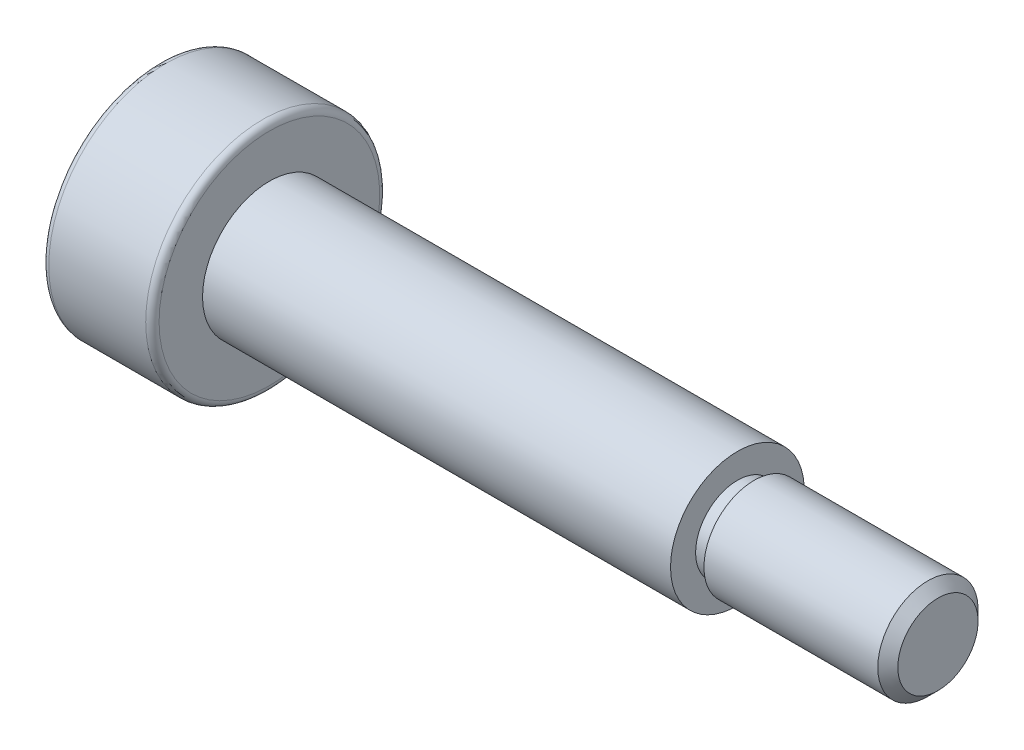
ISO-10303-21;
HEADER;
FILE_DESCRIPTION(('STEP AP214'),'2;1');
FILE_NAME('part.step','',(''),(''),'','','');
FILE_SCHEMA(('AUTOMOTIVE_DESIGN { 1 0 10303 214 1 1 1 1 }'));
ENDSEC;
DATA;
#1=APPLICATION_CONTEXT('core data for automotive mechanical design processes');
#2=APPLICATION_PROTOCOL_DEFINITION('international standard','automotive_design',2000,#1);
#3=PRODUCT_CONTEXT('',#1,'mechanical');
#4=PRODUCT('Part','Part','',(#3));
#5=PRODUCT_RELATED_PRODUCT_CATEGORY('part','',(#4));
#6=PRODUCT_DEFINITION_FORMATION('','',#4);
#7=PRODUCT_DEFINITION_CONTEXT('part definition',#1,'design');
#8=PRODUCT_DEFINITION('design','',#6,#7);
#9=PRODUCT_DEFINITION_SHAPE('','',#8);
#10=(LENGTH_UNIT() NAMED_UNIT(*) SI_UNIT(.MILLI.,.METRE.));
#11=(NAMED_UNIT(*) PLANE_ANGLE_UNIT() SI_UNIT($,.RADIAN.));
#12=(NAMED_UNIT(*) SI_UNIT($,.STERADIAN.) SOLID_ANGLE_UNIT());
#13=UNCERTAINTY_MEASURE_WITH_UNIT(LENGTH_MEASURE(1.E-05),#10,'distance_accuracy_value','');
#14=(GEOMETRIC_REPRESENTATION_CONTEXT(3) GLOBAL_UNCERTAINTY_ASSIGNED_CONTEXT((#13)) GLOBAL_UNIT_ASSIGNED_CONTEXT((#10,
#11,#12)) REPRESENTATION_CONTEXT('',''));
#15=CARTESIAN_POINT('',(0.,0.,0.));
#16=DIRECTION('',(0.,0.,1.));
#17=DIRECTION('',(1.,0.,0.));
#18=AXIS2_PLACEMENT_3D('',#15,#16,#17);
#19=CARTESIAN_POINT('',(-11.65,0.,0.));
#20=DIRECTION('',(1.,0.,0.));
#21=DIRECTION('',(0.,0.,-1.));
#22=AXIS2_PLACEMENT_3D('',#19,#20,#21);
#23=PLANE('',#22);
#24=DIRECTION('',(0.,0.866025403784438,-0.5));
#25=VECTOR('',#24,1.);
#26=CARTESIAN_POINT('',(-11.65,0.,1.73205080756888));
#27=LINE('',#26,#25);
#28=CARTESIAN_POINT('',(-11.65,0.,1.73205080756888));
#29=VERTEX_POINT('',#28);
#30=CARTESIAN_POINT('',(-11.65,1.5,0.866025403784438));
#31=VERTEX_POINT('',#30);
#32=EDGE_CURVE('E125',#29,#31,#27,.T.);
#33=ORIENTED_EDGE('',*,*,#32,.F.);
#34=DIRECTION('',(0.,0.866025403784439,0.5));
#35=VECTOR('',#34,1.);
#36=CARTESIAN_POINT('',(-11.65,-1.5,0.866025403784438));
#37=LINE('',#36,#35);
#38=CARTESIAN_POINT('',(-11.65,-1.5,0.866025403784438));
#39=VERTEX_POINT('',#38);
#40=EDGE_CURVE('E51',#39,#29,#37,.T.);
#41=ORIENTED_EDGE('',*,*,#40,.F.);
#42=DIRECTION('',(0.,0.,1.));
#43=VECTOR('',#42,1.);
#44=CARTESIAN_POINT('',(-11.65,-1.5,-0.866025403784438));
#45=LINE('',#44,#43);
#46=CARTESIAN_POINT('',(-11.65,-1.5,-0.866025403784438));
#47=VERTEX_POINT('',#46);
#48=EDGE_CURVE('E134',#47,#39,#45,.T.);
#49=ORIENTED_EDGE('',*,*,#48,.F.);
#50=DIRECTION('',(0.,-0.866025403784438,0.5));
#51=VECTOR('',#50,1.);
#52=CARTESIAN_POINT('',(-11.65,0.,-1.73205080756888));
#53=LINE('',#52,#51);
#54=CARTESIAN_POINT('',(-11.65,0.,-1.73205080756888));
#55=VERTEX_POINT('',#54);
#56=EDGE_CURVE('E132',#55,#47,#53,.T.);
#57=ORIENTED_EDGE('',*,*,#56,.F.);
#58=DIRECTION('',(0.,-0.866025403784439,-0.5));
#59=VECTOR('',#58,1.);
#60=CARTESIAN_POINT('',(-11.65,1.5,-0.866025403784438));
#61=LINE('',#60,#59);
#62=CARTESIAN_POINT('',(-11.65,1.5,-0.866025403784438));
#63=VERTEX_POINT('',#62);
#64=EDGE_CURVE('E99',#63,#55,#61,.T.);
#65=ORIENTED_EDGE('',*,*,#64,.F.);
#66=DIRECTION('',(0.,0.,-1.));
#67=VECTOR('',#66,1.);
#68=CARTESIAN_POINT('',(-11.65,1.5,0.866025403784438));
#69=LINE('',#68,#67);
#70=EDGE_CURVE('E128',#31,#63,#69,.T.);
#71=ORIENTED_EDGE('',*,*,#70,.F.);
#72=EDGE_LOOP('',(#33,#41,#49,#57,#65,#71));
#73=FACE_BOUND('',#72,.T.);
#74=CARTESIAN_POINT('',(-11.65,0.,0.));
#75=DIRECTION('',(1.,0.,0.));
#76=DIRECTION('',(0.,0.,-1.));
#77=AXIS2_PLACEMENT_3D('',#74,#75,#76);
#78=CIRCLE('',#77,3.3);
#79=CARTESIAN_POINT('',(-11.65,0.,-3.3));
#80=VERTEX_POINT('',#79);
#81=EDGE_CURVE('E167',#80,#80,#78,.F.);
#82=ORIENTED_EDGE('',*,*,#81,.T.);
#83=EDGE_LOOP('',(#82));
#84=FACE_BOUND('',#83,.T.);
#85=ADVANCED_FACE('F35',(#73,#84),#23,.F.);
#86=CARTESIAN_POINT('',(-11.65,0.,0.));
#87=DIRECTION('',(-1.,0.,0.));
#88=DIRECTION('',(0.,0.,1.));
#89=AXIS2_PLACEMENT_3D('',#86,#87,#88);
#90=CYLINDRICAL_SURFACE('',#89,3.5);
#91=CARTESIAN_POINT('',(-8.55,0.,0.));
#92=DIRECTION('',(-1.,0.,0.));
#93=DIRECTION('',(0.,0.,1.));
#94=AXIS2_PLACEMENT_3D('',#91,#92,#93);
#95=CIRCLE('',#94,3.5);
#96=CARTESIAN_POINT('',(-8.55,0.,3.5));
#97=VERTEX_POINT('',#96);
#98=EDGE_CURVE('E161',#97,#97,#95,.T.);
#99=ORIENTED_EDGE('',*,*,#98,.T.);
#100=EDGE_LOOP('',(#99));
#101=FACE_BOUND('',#100,.T.);
#102=CARTESIAN_POINT('',(-11.45,0.,0.));
#103=DIRECTION('',(1.,0.,0.));
#104=DIRECTION('',(0.,0.,-1.));
#105=AXIS2_PLACEMENT_3D('',#102,#103,#104);
#106=CIRCLE('',#105,3.5);
#107=CARTESIAN_POINT('',(-11.45,0.,-3.5));
#108=VERTEX_POINT('',#107);
#109=EDGE_CURVE('E158',#108,#108,#106,.T.);
#110=ORIENTED_EDGE('',*,*,#109,.T.);
#111=EDGE_LOOP('',(#110));
#112=FACE_BOUND('',#111,.T.);
#113=ADVANCED_FACE('F189',(#101,#112),#90,.T.);
#114=CARTESIAN_POINT('',(-8.35,3.5,0.));
#115=DIRECTION('',(-1.,0.,0.));
#116=DIRECTION('',(0.,0.,1.));
#117=AXIS2_PLACEMENT_3D('',#114,#115,#116);
#118=PLANE('',#117);
#119=CARTESIAN_POINT('',(-8.35,0.,0.));
#120=DIRECTION('',(-1.,0.,0.));
#121=DIRECTION('',(0.,0.,1.));
#122=AXIS2_PLACEMENT_3D('',#119,#120,#121);
#123=CIRCLE('',#122,3.3);
#124=CARTESIAN_POINT('',(-8.35,0.,3.3));
#125=VERTEX_POINT('',#124);
#126=EDGE_CURVE('E164',#125,#125,#123,.F.);
#127=ORIENTED_EDGE('',*,*,#126,.T.);
#128=EDGE_LOOP('',(#127));
#129=FACE_BOUND('',#128,.T.);
#130=CARTESIAN_POINT('',(-8.35,0.,0.));
#131=DIRECTION('',(-1.,0.,0.));
#132=DIRECTION('',(0.,0.,1.));
#133=AXIS2_PLACEMENT_3D('',#130,#131,#132);
#134=CIRCLE('',#133,2.);
#135=CARTESIAN_POINT('',(-8.35,0.,2.));
#136=VERTEX_POINT('',#135);
#137=EDGE_CURVE('E155',#136,#136,#134,.T.);
#138=ORIENTED_EDGE('',*,*,#137,.T.);
#139=EDGE_LOOP('',(#138));
#140=FACE_BOUND('',#139,.T.);
#141=ADVANCED_FACE('F195',(#129,#140),#118,.F.);
#142=CARTESIAN_POINT('',(-11.65,0.,0.));
#143=DIRECTION('',(-1.,0.,0.));
#144=DIRECTION('',(0.,0.,1.));
#145=AXIS2_PLACEMENT_3D('',#142,#143,#144);
#146=CYLINDRICAL_SURFACE('',#145,2.);
#147=ORIENTED_EDGE('',*,*,#137,.F.);
#148=EDGE_LOOP('',(#147));
#149=FACE_BOUND('',#148,.T.);
#150=CARTESIAN_POINT('',(5.65,0.,0.));
#151=DIRECTION('',(-1.,0.,0.));
#152=DIRECTION('',(0.,0.,1.));
#153=AXIS2_PLACEMENT_3D('',#150,#151,#152);
#154=CIRCLE('',#153,2.);
#155=CARTESIAN_POINT('',(5.65,0.,2.));
#156=VERTEX_POINT('',#155);
#157=EDGE_CURVE('E152',#156,#156,#154,.T.);
#158=ORIENTED_EDGE('',*,*,#157,.T.);
#159=EDGE_LOOP('',(#158));
#160=FACE_BOUND('',#159,.T.);
#161=ADVANCED_FACE('F229',(#149,#160),#146,.T.);
#162=CARTESIAN_POINT('',(5.65,2.,0.));
#163=DIRECTION('',(-1.,0.,0.));
#164=DIRECTION('',(0.,0.,1.));
#165=AXIS2_PLACEMENT_3D('',#162,#163,#164);
#166=PLANE('',#165);
#167=ORIENTED_EDGE('',*,*,#157,.F.);
#168=EDGE_LOOP('',(#167));
#169=FACE_BOUND('',#168,.T.);
#170=CARTESIAN_POINT('',(5.65,0.,0.));
#171=DIRECTION('',(-1.,0.,0.));
#172=DIRECTION('',(0.,0.,1.));
#173=AXIS2_PLACEMENT_3D('',#170,#171,#172);
#174=CIRCLE('',#173,1.25);
#175=CARTESIAN_POINT('',(5.65,0.,1.25));
#176=VERTEX_POINT('',#175);
#177=EDGE_CURVE('E149',#176,#176,#174,.T.);
#178=ORIENTED_EDGE('',*,*,#177,.T.);
#179=EDGE_LOOP('',(#178));
#180=FACE_BOUND('',#179,.T.);
#181=ADVANCED_FACE('F205',(#169,#180),#166,.F.);
#182=CARTESIAN_POINT('',(-8.55,0.,0.));
#183=DIRECTION('',(-1.,0.,0.));
#184=DIRECTION('',(0.,0.,1.));
#185=AXIS2_PLACEMENT_3D('',#182,#183,#184);
#186=TOROIDAL_SURFACE('',#185,3.3,0.2);
#187=ORIENTED_EDGE('',*,*,#126,.F.);
#188=EDGE_LOOP('',(#187));
#189=FACE_BOUND('',#188,.T.);
#190=ORIENTED_EDGE('',*,*,#98,.F.);
#191=EDGE_LOOP('',(#190));
#192=FACE_BOUND('',#191,.T.);
#193=ADVANCED_FACE('F202',(#189,#192),#186,.T.);
#194=CARTESIAN_POINT('',(-11.45,0.,0.));
#195=DIRECTION('',(1.,0.,0.));
#196=DIRECTION('',(0.,0.,-1.));
#197=AXIS2_PLACEMENT_3D('',#194,#195,#196);
#198=TOROIDAL_SURFACE('',#197,3.3,0.2);
#199=ORIENTED_EDGE('',*,*,#109,.F.);
#200=EDGE_LOOP('',(#199));
#201=FACE_BOUND('',#200,.T.);
#202=ORIENTED_EDGE('',*,*,#81,.F.);
#203=EDGE_LOOP('',(#202));
#204=FACE_BOUND('',#203,.T.);
#205=ADVANCED_FACE('F204',(#201,#204),#198,.T.);
#206=CARTESIAN_POINT('',(5.65,0.,0.));
#207=DIRECTION('',(-1.,0.,0.));
#208=DIRECTION('',(0.,0.,1.));
#209=AXIS2_PLACEMENT_3D('',#206,#207,#208);
#210=CYLINDRICAL_SURFACE('',#209,1.25);
#211=CARTESIAN_POINT('',(6.15,0.,0.));
#212=DIRECTION('',(-1.,0.,0.));
#213=DIRECTION('',(0.,0.,1.));
#214=AXIS2_PLACEMENT_3D('',#211,#212,#213);
#215=CIRCLE('',#214,1.25);
#216=CARTESIAN_POINT('',(6.15,0.,1.25));
#217=VERTEX_POINT('',#216);
#218=EDGE_CURVE('E146',#217,#217,#215,.T.);
#219=ORIENTED_EDGE('',*,*,#218,.T.);
#220=EDGE_LOOP('',(#219));
#221=FACE_BOUND('',#220,.T.);
#222=ORIENTED_EDGE('',*,*,#177,.F.);
#223=EDGE_LOOP('',(#222));
#224=FACE_BOUND('',#223,.T.);
#225=ADVANCED_FACE('F208',(#221,#224),#210,.T.);
#226=CARTESIAN_POINT('',(6.15,1.5,0.));
#227=DIRECTION('',(-1.,0.,0.));
#228=DIRECTION('',(0.,0.,1.));
#229=AXIS2_PLACEMENT_3D('',#226,#227,#228);
#230=PLANE('',#229);
#231=CARTESIAN_POINT('',(6.15,0.,0.));
#232=DIRECTION('',(-1.,0.,0.));
#233=DIRECTION('',(0.,0.,1.));
#234=AXIS2_PLACEMENT_3D('',#231,#232,#233);
#235=CIRCLE('',#234,1.5);
#236=CARTESIAN_POINT('',(6.15,0.,1.5));
#237=VERTEX_POINT('',#236);
#238=EDGE_CURVE('E138',#237,#237,#235,.T.);
#239=ORIENTED_EDGE('',*,*,#238,.T.);
#240=EDGE_LOOP('',(#239));
#241=FACE_BOUND('',#240,.T.);
#242=ORIENTED_EDGE('',*,*,#218,.F.);
#243=EDGE_LOOP('',(#242));
#244=FACE_BOUND('',#243,.T.);
#245=ADVANCED_FACE('F184',(#241,#244),#230,.T.);
#246=CARTESIAN_POINT('',(11.65,1.5,0.));
#247=DIRECTION('',(-1.,0.,0.));
#248=DIRECTION('',(0.,0.,1.));
#249=AXIS2_PLACEMENT_3D('',#246,#247,#248);
#250=PLANE('',#249);
#251=CARTESIAN_POINT('',(11.65,0.,0.));
#252=DIRECTION('',(-1.,0.,0.));
#253=DIRECTION('',(0.,0.,1.));
#254=AXIS2_PLACEMENT_3D('',#251,#252,#253);
#255=CIRCLE('',#254,1.2);
#256=CARTESIAN_POINT('',(11.65,0.,1.2));
#257=VERTEX_POINT('',#256);
#258=EDGE_CURVE('E11',#257,#257,#255,.F.);
#259=ORIENTED_EDGE('',*,*,#258,.T.);
#260=EDGE_LOOP('',(#259));
#261=FACE_BOUND('',#260,.T.);
#262=ADVANCED_FACE('F176',(#261),#250,.F.);
#263=CARTESIAN_POINT('',(11.35,0.,0.));
#264=DIRECTION('',(-1.,0.,0.));
#265=DIRECTION('',(0.,0.,1.));
#266=AXIS2_PLACEMENT_3D('',#263,#264,#265);
#267=CONICAL_SURFACE('',#266,1.5,0.785398163397452);
#268=ORIENTED_EDGE('',*,*,#258,.F.);
#269=EDGE_LOOP('',(#268));
#270=FACE_BOUND('',#269,.T.);
#271=CARTESIAN_POINT('',(11.35,0.,0.));
#272=DIRECTION('',(-1.,0.,0.));
#273=DIRECTION('',(0.,0.,1.));
#274=AXIS2_PLACEMENT_3D('',#271,#272,#273);
#275=CIRCLE('',#274,1.5);
#276=CARTESIAN_POINT('',(11.35,0.,1.5));
#277=VERTEX_POINT('',#276);
#278=EDGE_CURVE('E44',#277,#277,#275,.T.);
#279=ORIENTED_EDGE('',*,*,#278,.F.);
#280=EDGE_LOOP('',(#279));
#281=FACE_BOUND('',#280,.T.);
#282=ADVANCED_FACE('F38',(#270,#281),#267,.T.);
#283=CARTESIAN_POINT('',(-11.65,0.,0.));
#284=DIRECTION('',(-1.,0.,0.));
#285=DIRECTION('',(0.,0.,1.));
#286=AXIS2_PLACEMENT_3D('',#283,#284,#285);
#287=CYLINDRICAL_SURFACE('',#286,1.5);
#288=ORIENTED_EDGE('',*,*,#278,.T.);
#289=EDGE_LOOP('',(#288));
#290=FACE_BOUND('',#289,.T.);
#291=ORIENTED_EDGE('',*,*,#238,.F.);
#292=EDGE_LOOP('',(#291));
#293=FACE_BOUND('',#292,.T.);
#294=ADVANCED_FACE('F172',(#290,#293),#287,.T.);
#295=CARTESIAN_POINT('',(-9.65,-1.5,0.866025403784438));
#296=DIRECTION('',(0.,-0.5,0.866025403784439));
#297=DIRECTION('',(0.,-0.866025403784439,-0.5));
#298=AXIS2_PLACEMENT_3D('',#295,#296,#297);
#299=PLANE('',#298);
#300=ORIENTED_EDGE('',*,*,#40,.T.);
#301=DIRECTION('',(-1.,0.,0.));
#302=VECTOR('',#301,1.);
#303=CARTESIAN_POINT('',(-9.65,0.,1.73205080756888));
#304=LINE('',#303,#302);
#305=CARTESIAN_POINT('',(-9.65,0.,1.73205080756888));
#306=VERTEX_POINT('',#305);
#307=EDGE_CURVE('E81',#306,#29,#304,.T.);
#308=ORIENTED_EDGE('',*,*,#307,.F.);
#309=DIRECTION('',(0.,0.866025403784439,0.5));
#310=VECTOR('',#309,1.);
#311=CARTESIAN_POINT('',(-9.65,-1.5,0.866025403784438));
#312=LINE('',#311,#310);
#313=CARTESIAN_POINT('',(-9.65,-1.5,0.866025403784438));
#314=VERTEX_POINT('',#313);
#315=EDGE_CURVE('E136',#314,#306,#312,.T.);
#316=ORIENTED_EDGE('',*,*,#315,.F.);
#317=DIRECTION('',(-1.,0.,0.));
#318=VECTOR('',#317,1.);
#319=CARTESIAN_POINT('',(-9.65,-1.5,0.866025403784438));
#320=LINE('',#319,#318);
#321=EDGE_CURVE('E59',#314,#39,#320,.T.);
#322=ORIENTED_EDGE('',*,*,#321,.T.);
#323=EDGE_LOOP('',(#300,#308,#316,#322));
#324=FACE_BOUND('',#323,.T.);
#325=ADVANCED_FACE('F182',(#324),#299,.F.);
#326=CARTESIAN_POINT('',(-9.65,-1.5,-0.866025403784438));
#327=DIRECTION('',(0.,-1.,0.));
#328=DIRECTION('',(0.,0.,-1.));
#329=AXIS2_PLACEMENT_3D('',#326,#327,#328);
#330=PLANE('',#329);
#331=ORIENTED_EDGE('',*,*,#48,.T.);
#332=ORIENTED_EDGE('',*,*,#321,.F.);
#333=DIRECTION('',(0.,0.,1.));
#334=VECTOR('',#333,1.);
#335=CARTESIAN_POINT('',(-9.65,-1.5,-0.866025403784438));
#336=LINE('',#335,#334);
#337=CARTESIAN_POINT('',(-9.65,-1.5,-0.866025403784438));
#338=VERTEX_POINT('',#337);
#339=EDGE_CURVE('E111',#338,#314,#336,.T.);
#340=ORIENTED_EDGE('',*,*,#339,.F.);
#341=DIRECTION('',(-1.,0.,0.));
#342=VECTOR('',#341,1.);
#343=CARTESIAN_POINT('',(-9.65,-1.5,-0.866025403784438));
#344=LINE('',#343,#342);
#345=EDGE_CURVE('E103',#338,#47,#344,.T.);
#346=ORIENTED_EDGE('',*,*,#345,.T.);
#347=EDGE_LOOP('',(#331,#332,#340,#346));
#348=FACE_BOUND('',#347,.T.);
#349=ADVANCED_FACE('F303',(#348),#330,.F.);
#350=CARTESIAN_POINT('',(-9.65,0.,-1.73205080756888));
#351=DIRECTION('',(0.,-0.5,-0.866025403784438));
#352=DIRECTION('',(0.,0.866025403784439,-0.5));
#353=AXIS2_PLACEMENT_3D('',#350,#351,#352);
#354=PLANE('',#353);
#355=ORIENTED_EDGE('',*,*,#56,.T.);
#356=ORIENTED_EDGE('',*,*,#345,.F.);
#357=DIRECTION('',(0.,-0.866025403784438,0.5));
#358=VECTOR('',#357,1.);
#359=CARTESIAN_POINT('',(-9.65,0.,-1.73205080756888));
#360=LINE('',#359,#358);
#361=CARTESIAN_POINT('',(-9.65,0.,-1.73205080756888));
#362=VERTEX_POINT('',#361);
#363=EDGE_CURVE('E107',#362,#338,#360,.T.);
#364=ORIENTED_EDGE('',*,*,#363,.F.);
#365=DIRECTION('',(-1.,0.,0.));
#366=VECTOR('',#365,1.);
#367=CARTESIAN_POINT('',(-9.65,0.,-1.73205080756888));
#368=LINE('',#367,#366);
#369=EDGE_CURVE('E92',#362,#55,#368,.T.);
#370=ORIENTED_EDGE('',*,*,#369,.T.);
#371=EDGE_LOOP('',(#355,#356,#364,#370));
#372=FACE_BOUND('',#371,.T.);
#373=ADVANCED_FACE('F108',(#372),#354,.F.);
#374=CARTESIAN_POINT('',(-9.65,1.5,-0.866025403784438));
#375=DIRECTION('',(0.,0.5,-0.866025403784439));
#376=DIRECTION('',(0.,0.866025403784439,0.5));
#377=AXIS2_PLACEMENT_3D('',#374,#375,#376);
#378=PLANE('',#377);
#379=ORIENTED_EDGE('',*,*,#64,.T.);
#380=ORIENTED_EDGE('',*,*,#369,.F.);
#381=DIRECTION('',(0.,-0.866025403784439,-0.5));
#382=VECTOR('',#381,1.);
#383=CARTESIAN_POINT('',(-9.65,1.5,-0.866025403784438));
#384=LINE('',#383,#382);
#385=CARTESIAN_POINT('',(-9.65,1.5,-0.866025403784438));
#386=VERTEX_POINT('',#385);
#387=EDGE_CURVE('E96',#386,#362,#384,.T.);
#388=ORIENTED_EDGE('',*,*,#387,.F.);
#389=DIRECTION('',(-1.,0.,0.));
#390=VECTOR('',#389,1.);
#391=CARTESIAN_POINT('',(-9.65,1.5,-0.866025403784438));
#392=LINE('',#391,#390);
#393=EDGE_CURVE('E104',#386,#63,#392,.T.);
#394=ORIENTED_EDGE('',*,*,#393,.T.);
#395=EDGE_LOOP('',(#379,#380,#388,#394));
#396=FACE_BOUND('',#395,.T.);
#397=ADVANCED_FACE('F94',(#396),#378,.F.);
#398=CARTESIAN_POINT('',(-9.65,1.5,0.866025403784438));
#399=DIRECTION('',(0.,1.,0.));
#400=DIRECTION('',(0.,0.,1.));
#401=AXIS2_PLACEMENT_3D('',#398,#399,#400);
#402=PLANE('',#401);
#403=ORIENTED_EDGE('',*,*,#70,.T.);
#404=ORIENTED_EDGE('',*,*,#393,.F.);
#405=DIRECTION('',(0.,0.,-1.));
#406=VECTOR('',#405,1.);
#407=CARTESIAN_POINT('',(-9.65,1.5,0.866025403784438));
#408=LINE('',#407,#406);
#409=CARTESIAN_POINT('',(-9.65,1.5,0.866025403784438));
#410=VERTEX_POINT('',#409);
#411=EDGE_CURVE('E117',#410,#386,#408,.T.);
#412=ORIENTED_EDGE('',*,*,#411,.F.);
#413=DIRECTION('',(-1.,0.,0.));
#414=VECTOR('',#413,1.);
#415=CARTESIAN_POINT('',(-9.65,1.5,0.866025403784438));
#416=LINE('',#415,#414);
#417=EDGE_CURVE('E141',#410,#31,#416,.T.);
#418=ORIENTED_EDGE('',*,*,#417,.T.);
#419=EDGE_LOOP('',(#403,#404,#412,#418));
#420=FACE_BOUND('',#419,.T.);
#421=ADVANCED_FACE('F324',(#420),#402,.F.);
#422=CARTESIAN_POINT('',(-9.65,0.,1.73205080756888));
#423=DIRECTION('',(0.,0.5,0.866025403784438));
#424=DIRECTION('',(0.,-0.866025403784439,0.5));
#425=AXIS2_PLACEMENT_3D('',#422,#423,#424);
#426=PLANE('',#425);
#427=ORIENTED_EDGE('',*,*,#32,.T.);
#428=ORIENTED_EDGE('',*,*,#417,.F.);
#429=DIRECTION('',(0.,0.866025403784438,-0.5));
#430=VECTOR('',#429,1.);
#431=CARTESIAN_POINT('',(-9.65,0.,1.73205080756888));
#432=LINE('',#431,#430);
#433=EDGE_CURVE('E119',#306,#410,#432,.T.);
#434=ORIENTED_EDGE('',*,*,#433,.F.);
#435=ORIENTED_EDGE('',*,*,#307,.T.);
#436=EDGE_LOOP('',(#427,#428,#434,#435));
#437=FACE_BOUND('',#436,.T.);
#438=ADVANCED_FACE('F332',(#437),#426,.F.);
#439=CARTESIAN_POINT('',(-9.65,0.,0.));
#440=DIRECTION('',(-1.,0.,0.));
#441=DIRECTION('',(0.,0.,1.));
#442=AXIS2_PLACEMENT_3D('',#439,#440,#441);
#443=PLANE('',#442);
#444=ORIENTED_EDGE('',*,*,#315,.T.);
#445=ORIENTED_EDGE('',*,*,#433,.T.);
#446=ORIENTED_EDGE('',*,*,#411,.T.);
#447=ORIENTED_EDGE('',*,*,#387,.T.);
#448=ORIENTED_EDGE('',*,*,#363,.T.);
#449=ORIENTED_EDGE('',*,*,#339,.T.);
#450=EDGE_LOOP('',(#444,#445,#446,#447,#448,#449));
#451=FACE_BOUND('',#450,.T.);
#452=ADVANCED_FACE('F114',(#451),#443,.T.);
#453=CLOSED_SHELL('',(#85,#113,#141,#161,#181,#193,#205,#225,#245,#262,#282,#294,#325,#349,#373,
#397,#421,#438,#452));
#454=MANIFOLD_SOLID_BREP('B2',#453);
#455=ADVANCED_BREP_SHAPE_REPRESENTATION('',(#18,#454),#14);
#456=SHAPE_DEFINITION_REPRESENTATION(#9,#455);
ENDSEC;
END-ISO-10303-21;
